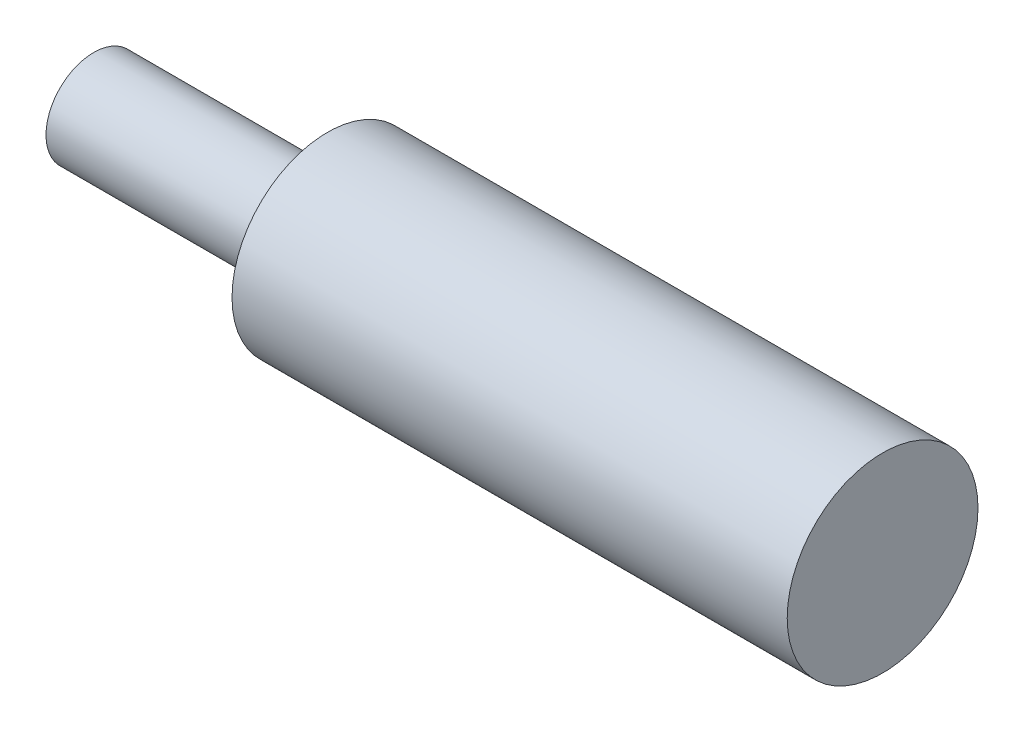
ISO-10303-21;
HEADER;
FILE_DESCRIPTION(('STEP AP214'),'2;1');
FILE_NAME('part.step','',(''),(''),'','','');
FILE_SCHEMA(('AUTOMOTIVE_DESIGN { 1 0 10303 214 1 1 1 1 }'));
ENDSEC;
DATA;
#1=APPLICATION_CONTEXT('core data for automotive mechanical design processes');
#2=APPLICATION_PROTOCOL_DEFINITION('international standard','automotive_design',2000,#1);
#3=PRODUCT_CONTEXT('',#1,'mechanical');
#4=PRODUCT('Part','Part','',(#3));
#5=PRODUCT_RELATED_PRODUCT_CATEGORY('part','',(#4));
#6=PRODUCT_DEFINITION_FORMATION('','',#4);
#7=PRODUCT_DEFINITION_CONTEXT('part definition',#1,'design');
#8=PRODUCT_DEFINITION('design','',#6,#7);
#9=PRODUCT_DEFINITION_SHAPE('','',#8);
#10=(LENGTH_UNIT() NAMED_UNIT(*) SI_UNIT(.MILLI.,.METRE.));
#11=(NAMED_UNIT(*) PLANE_ANGLE_UNIT() SI_UNIT($,.RADIAN.));
#12=(NAMED_UNIT(*) SI_UNIT($,.STERADIAN.) SOLID_ANGLE_UNIT());
#13=UNCERTAINTY_MEASURE_WITH_UNIT(LENGTH_MEASURE(1.E-05),#10,'distance_accuracy_value','');
#14=(GEOMETRIC_REPRESENTATION_CONTEXT(3) GLOBAL_UNCERTAINTY_ASSIGNED_CONTEXT((#13)) GLOBAL_UNIT_ASSIGNED_CONTEXT((#10,
#11,#12)) REPRESENTATION_CONTEXT('',''));
#15=CARTESIAN_POINT('',(0.,0.,0.));
#16=DIRECTION('',(0.,0.,1.));
#17=DIRECTION('',(1.,0.,0.));
#18=AXIS2_PLACEMENT_3D('',#15,#16,#17);
#19=CARTESIAN_POINT('',(3007.306279455,11.5,25.3342));
#20=DIRECTION('',(-1.,0.,0.));
#21=DIRECTION('',(0.,0.,1.));
#22=AXIS2_PLACEMENT_3D('',#19,#20,#21);
#23=CYLINDRICAL_SURFACE('',#22,5.);
#24=CARTESIAN_POINT('',(2910.46414383127,11.5,25.3342));
#25=DIRECTION('',(-1.,0.,0.));
#26=DIRECTION('',(0.,0.,1.));
#27=AXIS2_PLACEMENT_3D('',#24,#25,#26);
#28=CIRCLE('',#27,5.);
#29=CARTESIAN_POINT('',(2910.46414383127,11.5,30.3342));
#30=VERTEX_POINT('',#29);
#31=EDGE_CURVE('E10',#30,#30,#28,.T.);
#32=ORIENTED_EDGE('',*,*,#31,.F.);
#33=EDGE_LOOP('',(#32));
#34=FACE_BOUND('',#33,.T.);
#35=CARTESIAN_POINT('',(2934.96414383127,11.5,25.3342));
#36=DIRECTION('',(1.,0.,0.));
#37=DIRECTION('',(0.,0.,-1.));
#38=AXIS2_PLACEMENT_3D('',#35,#36,#37);
#39=CIRCLE('',#38,5.);
#40=CARTESIAN_POINT('',(2934.96414383127,11.5,20.3342));
#41=VERTEX_POINT('',#40);
#42=EDGE_CURVE('E32',#41,#41,#39,.F.);
#43=ORIENTED_EDGE('',*,*,#42,.T.);
#44=EDGE_LOOP('',(#43));
#45=FACE_BOUND('',#44,.T.);
#46=ADVANCED_FACE('F29',(#34,#45),#23,.T.);
#47=CARTESIAN_POINT('',(2910.46414383127,11.5,25.3342));
#48=DIRECTION('',(-1.,0.,0.));
#49=DIRECTION('',(0.,0.,1.));
#50=AXIS2_PLACEMENT_3D('',#47,#48,#49);
#51=PLANE('',#50);
#52=ORIENTED_EDGE('',*,*,#31,.T.);
#53=EDGE_LOOP('',(#52));
#54=FACE_BOUND('',#53,.T.);
#55=ADVANCED_FACE('F60',(#54),#51,.T.);
#56=CARTESIAN_POINT('',(2906.67987258381,11.5,25.3342));
#57=DIRECTION('',(1.,0.,0.));
#58=DIRECTION('',(0.,0.,-1.));
#59=AXIS2_PLACEMENT_3D('',#56,#57,#58);
#60=CYLINDRICAL_SURFACE('',#59,9.99999999999999);
#61=CARTESIAN_POINT('',(2934.96414383127,11.5,25.3342));
#62=DIRECTION('',(1.,0.,0.));
#63=DIRECTION('',(0.,0.,-1.));
#64=AXIS2_PLACEMENT_3D('',#61,#62,#63);
#65=CIRCLE('',#64,9.99999999999999);
#66=CARTESIAN_POINT('',(2934.96414383127,11.5,15.3342));
#67=VERTEX_POINT('',#66);
#68=EDGE_CURVE('E39',#67,#67,#65,.T.);
#69=ORIENTED_EDGE('',*,*,#68,.T.);
#70=EDGE_LOOP('',(#69));
#71=FACE_BOUND('',#70,.T.);
#72=CARTESIAN_POINT('',(2993.16414383127,11.5,25.3342));
#73=DIRECTION('',(-1.,0.,0.));
#74=DIRECTION('',(0.,0.,1.));
#75=AXIS2_PLACEMENT_3D('',#72,#73,#74);
#76=CIRCLE('',#75,9.99999999999999);
#77=CARTESIAN_POINT('',(2993.16414383127,11.5,35.3342));
#78=VERTEX_POINT('',#77);
#79=EDGE_CURVE('E43',#78,#78,#76,.T.);
#80=ORIENTED_EDGE('',*,*,#79,.T.);
#81=EDGE_LOOP('',(#80));
#82=FACE_BOUND('',#81,.T.);
#83=ADVANCED_FACE('F47',(#71,#82),#60,.T.);
#84=CARTESIAN_POINT('',(2934.96414383127,11.5,8.87500000000001));
#85=DIRECTION('',(1.,0.,0.));
#86=DIRECTION('',(0.,0.,-1.));
#87=AXIS2_PLACEMENT_3D('',#84,#85,#86);
#88=PLANE('',#87);
#89=ORIENTED_EDGE('',*,*,#42,.F.);
#90=EDGE_LOOP('',(#89));
#91=FACE_BOUND('',#90,.T.);
#92=ORIENTED_EDGE('',*,*,#68,.F.);
#93=EDGE_LOOP('',(#92));
#94=FACE_BOUND('',#93,.T.);
#95=ADVANCED_FACE('F51',(#91,#94),#88,.F.);
#96=CARTESIAN_POINT('',(2993.16414383127,11.5,8.87500000000001));
#97=DIRECTION('',(-1.,0.,0.));
#98=DIRECTION('',(0.,0.,1.));
#99=AXIS2_PLACEMENT_3D('',#96,#97,#98);
#100=PLANE('',#99);
#101=ORIENTED_EDGE('',*,*,#79,.F.);
#102=EDGE_LOOP('',(#101));
#103=FACE_BOUND('',#102,.T.);
#104=ADVANCED_FACE('F49',(#103),#100,.F.);
#105=CLOSED_SHELL('',(#46,#55,#83,#95,#104));
#106=MANIFOLD_SOLID_BREP('B2',#105);
#107=ADVANCED_BREP_SHAPE_REPRESENTATION('',(#18,#106),#14);
#108=SHAPE_DEFINITION_REPRESENTATION(#9,#107);
ENDSEC;
END-ISO-10303-21;
